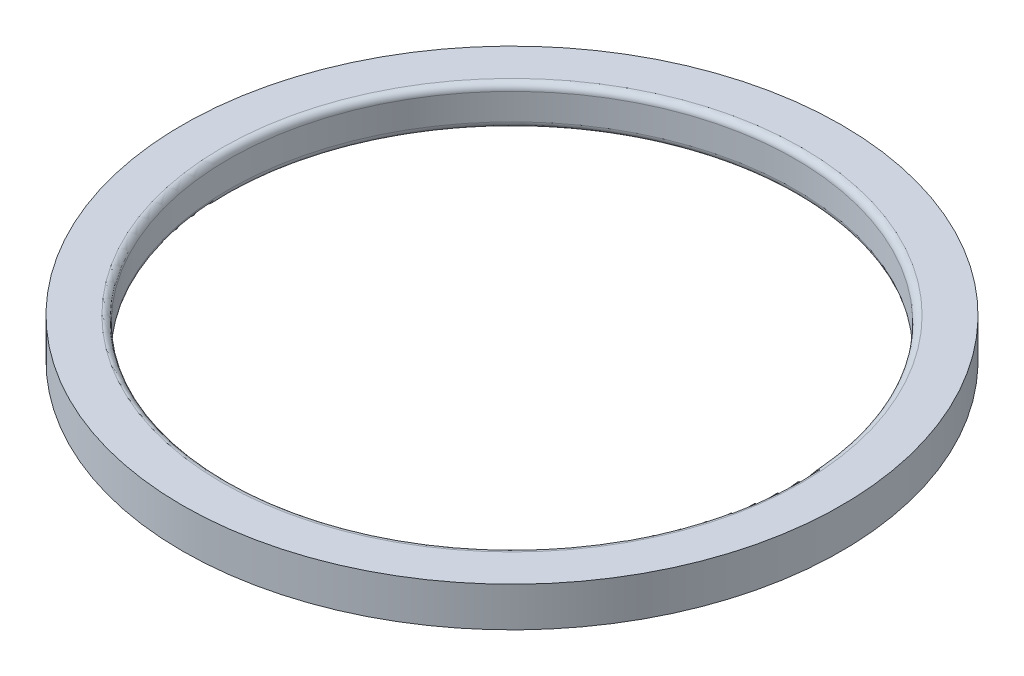
ISO-10303-21;
HEADER;
FILE_DESCRIPTION(('STEP AP214'),'2;1');
FILE_NAME('part.step','',(''),(''),'','','');
FILE_SCHEMA(('AUTOMOTIVE_DESIGN { 1 0 10303 214 1 1 1 1 }'));
ENDSEC;
DATA;
#1=APPLICATION_CONTEXT('core data for automotive mechanical design processes');
#2=APPLICATION_PROTOCOL_DEFINITION('international standard','automotive_design',2000,#1);
#3=PRODUCT_CONTEXT('',#1,'mechanical');
#4=PRODUCT('Part','Part','',(#3));
#5=PRODUCT_RELATED_PRODUCT_CATEGORY('part','',(#4));
#6=PRODUCT_DEFINITION_FORMATION('','',#4);
#7=PRODUCT_DEFINITION_CONTEXT('part definition',#1,'design');
#8=PRODUCT_DEFINITION('design','',#6,#7);
#9=PRODUCT_DEFINITION_SHAPE('','',#8);
#10=(LENGTH_UNIT() NAMED_UNIT(*) SI_UNIT(.MILLI.,.METRE.));
#11=(NAMED_UNIT(*) PLANE_ANGLE_UNIT() SI_UNIT($,.RADIAN.));
#12=(NAMED_UNIT(*) SI_UNIT($,.STERADIAN.) SOLID_ANGLE_UNIT());
#13=UNCERTAINTY_MEASURE_WITH_UNIT(LENGTH_MEASURE(1.E-05),#10,'distance_accuracy_value','');
#14=(GEOMETRIC_REPRESENTATION_CONTEXT(3) GLOBAL_UNCERTAINTY_ASSIGNED_CONTEXT((#13)) GLOBAL_UNIT_ASSIGNED_CONTEXT((#10,
#11,#12)) REPRESENTATION_CONTEXT('',''));
#15=CARTESIAN_POINT('',(0.,0.,0.));
#16=DIRECTION('',(0.,0.,1.));
#17=DIRECTION('',(1.,0.,0.));
#18=AXIS2_PLACEMENT_3D('',#15,#16,#17);
#19=CARTESIAN_POINT('',(0.,6.,0.));
#20=DIRECTION('',(0.,1.,0.));
#21=DIRECTION('',(0.,0.,1.));
#22=AXIS2_PLACEMENT_3D('',#19,#20,#21);
#23=PLANE('',#22);
#24=CARTESIAN_POINT('',(0.,6.,0.));
#25=DIRECTION('',(0.,1.,0.));
#26=DIRECTION('',(0.,0.,1.));
#27=AXIS2_PLACEMENT_3D('',#24,#25,#26);
#28=CIRCLE('',#27,44.);
#29=CARTESIAN_POINT('',(0.,6.,44.));
#30=VERTEX_POINT('',#29);
#31=EDGE_CURVE('E10',#30,#30,#28,.F.);
#32=ORIENTED_EDGE('',*,*,#31,.T.);
#33=EDGE_LOOP('',(#32));
#34=FACE_BOUND('',#33,.T.);
#35=CARTESIAN_POINT('',(0.,6.,0.));
#36=DIRECTION('',(0.,1.,0.));
#37=DIRECTION('',(0.,0.,1.));
#38=AXIS2_PLACEMENT_3D('',#35,#36,#37);
#39=CIRCLE('',#38,50.);
#40=CARTESIAN_POINT('',(0.,6.,50.));
#41=VERTEX_POINT('',#40);
#42=EDGE_CURVE('E51',#41,#41,#39,.T.);
#43=ORIENTED_EDGE('',*,*,#42,.T.);
#44=EDGE_LOOP('',(#43));
#45=FACE_BOUND('',#44,.T.);
#46=ADVANCED_FACE('F31',(#34,#45),#23,.T.);
#47=CARTESIAN_POINT('',(0.,0.,0.));
#48=DIRECTION('',(0.,1.,0.));
#49=DIRECTION('',(0.,0.,1.));
#50=AXIS2_PLACEMENT_3D('',#47,#48,#49);
#51=PLANE('',#50);
#52=CARTESIAN_POINT('',(0.,0.,0.));
#53=DIRECTION('',(0.,1.,0.));
#54=DIRECTION('',(0.,0.,1.));
#55=AXIS2_PLACEMENT_3D('',#52,#53,#54);
#56=CIRCLE('',#55,44.);
#57=CARTESIAN_POINT('',(0.,0.,44.));
#58=VERTEX_POINT('',#57);
#59=EDGE_CURVE('E46',#58,#58,#56,.T.);
#60=ORIENTED_EDGE('',*,*,#59,.T.);
#61=EDGE_LOOP('',(#60));
#62=FACE_BOUND('',#61,.T.);
#63=CARTESIAN_POINT('',(0.,0.,0.));
#64=DIRECTION('',(0.,1.,0.));
#65=DIRECTION('',(0.,0.,1.));
#66=AXIS2_PLACEMENT_3D('',#63,#64,#65);
#67=CIRCLE('',#66,50.);
#68=CARTESIAN_POINT('',(0.,0.,50.));
#69=VERTEX_POINT('',#68);
#70=EDGE_CURVE('E52',#69,#69,#67,.T.);
#71=ORIENTED_EDGE('',*,*,#70,.F.);
#72=EDGE_LOOP('',(#71));
#73=FACE_BOUND('',#72,.T.);
#74=ADVANCED_FACE('F63',(#62,#73),#51,.F.);
#75=CARTESIAN_POINT('',(0.,6.,0.));
#76=DIRECTION('',(0.,-1.,0.));
#77=DIRECTION('',(0.,0.,-1.));
#78=AXIS2_PLACEMENT_3D('',#75,#76,#77);
#79=CYLINDRICAL_SURFACE('',#78,50.);
#80=ORIENTED_EDGE('',*,*,#42,.F.);
#81=EDGE_LOOP('',(#80));
#82=FACE_BOUND('',#81,.T.);
#83=ORIENTED_EDGE('',*,*,#70,.T.);
#84=EDGE_LOOP('',(#83));
#85=FACE_BOUND('',#84,.T.);
#86=ADVANCED_FACE('F59',(#82,#85),#79,.T.);
#87=CARTESIAN_POINT('',(0.,6.,0.));
#88=DIRECTION('',(0.,-1.,0.));
#89=DIRECTION('',(0.,0.,-1.));
#90=AXIS2_PLACEMENT_3D('',#87,#88,#89);
#91=CYLINDRICAL_SURFACE('',#90,43.);
#92=CARTESIAN_POINT('',(0.,1.,0.));
#93=DIRECTION('',(0.,1.,0.));
#94=DIRECTION('',(0.,0.,1.));
#95=AXIS2_PLACEMENT_3D('',#92,#93,#94);
#96=CIRCLE('',#95,43.);
#97=CARTESIAN_POINT('',(0.,1.,43.));
#98=VERTEX_POINT('',#97);
#99=EDGE_CURVE('E38',#98,#98,#96,.F.);
#100=ORIENTED_EDGE('',*,*,#99,.T.);
#101=EDGE_LOOP('',(#100));
#102=FACE_BOUND('',#101,.T.);
#103=CARTESIAN_POINT('',(0.,5.,0.));
#104=DIRECTION('',(0.,1.,0.));
#105=DIRECTION('',(0.,0.,1.));
#106=AXIS2_PLACEMENT_3D('',#103,#104,#105);
#107=CIRCLE('',#106,43.);
#108=CARTESIAN_POINT('',(0.,5.,43.));
#109=VERTEX_POINT('',#108);
#110=EDGE_CURVE('E42',#109,#109,#107,.T.);
#111=ORIENTED_EDGE('',*,*,#110,.T.);
#112=EDGE_LOOP('',(#111));
#113=FACE_BOUND('',#112,.T.);
#114=ADVANCED_FACE('F62',(#102,#113),#91,.F.);
#115=CARTESIAN_POINT('',(0.,1.,0.));
#116=DIRECTION('',(0.,1.,0.));
#117=DIRECTION('',(0.,0.,1.));
#118=AXIS2_PLACEMENT_3D('',#115,#116,#117);
#119=TOROIDAL_SURFACE('',#118,44.,1.);
#120=ORIENTED_EDGE('',*,*,#99,.F.);
#121=EDGE_LOOP('',(#120));
#122=FACE_BOUND('',#121,.T.);
#123=ORIENTED_EDGE('',*,*,#59,.F.);
#124=EDGE_LOOP('',(#123));
#125=FACE_BOUND('',#124,.T.);
#126=ADVANCED_FACE('F75',(#122,#125),#119,.T.);
#127=CARTESIAN_POINT('',(0.,5.,0.));
#128=DIRECTION('',(0.,1.,0.));
#129=DIRECTION('',(0.,0.,1.));
#130=AXIS2_PLACEMENT_3D('',#127,#128,#129);
#131=TOROIDAL_SURFACE('',#130,44.,1.);
#132=ORIENTED_EDGE('',*,*,#31,.F.);
#133=EDGE_LOOP('',(#132));
#134=FACE_BOUND('',#133,.T.);
#135=ORIENTED_EDGE('',*,*,#110,.F.);
#136=EDGE_LOOP('',(#135));
#137=FACE_BOUND('',#136,.T.);
#138=ADVANCED_FACE('F33',(#134,#137),#131,.T.);
#139=CLOSED_SHELL('',(#46,#74,#86,#114,#126,#138));
#140=MANIFOLD_SOLID_BREP('B2',#139);
#141=ADVANCED_BREP_SHAPE_REPRESENTATION('',(#18,#140),#14);
#142=SHAPE_DEFINITION_REPRESENTATION(#9,#141);
ENDSEC;
END-ISO-10303-21;
